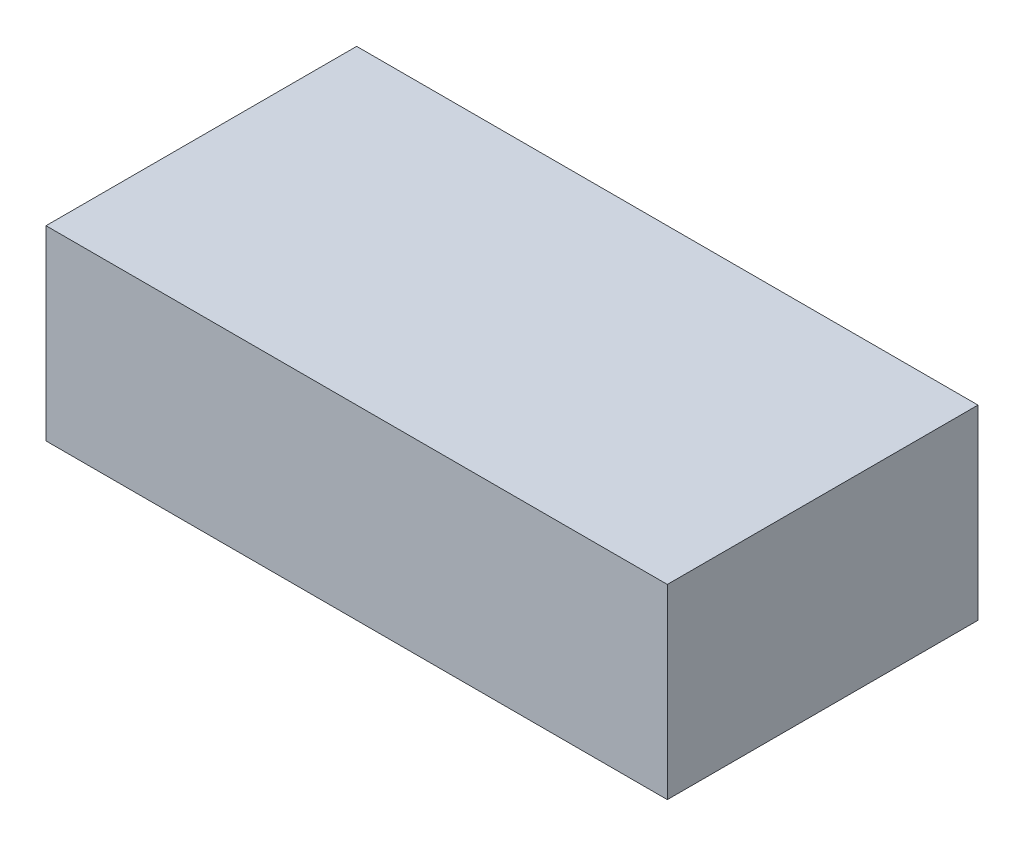
ISO-10303-21;
HEADER;
FILE_DESCRIPTION(('STEP AP214'),'2;1');
FILE_NAME('part.step','',(''),(''),'','','');
FILE_SCHEMA(('AUTOMOTIVE_DESIGN { 1 0 10303 214 1 1 1 1 }'));
ENDSEC;
DATA;
#1=APPLICATION_CONTEXT('core data for automotive mechanical design processes');
#2=APPLICATION_PROTOCOL_DEFINITION('international standard','automotive_design',2000,#1);
#3=PRODUCT_CONTEXT('',#1,'mechanical');
#4=PRODUCT('Part','Part','',(#3));
#5=PRODUCT_RELATED_PRODUCT_CATEGORY('part','',(#4));
#6=PRODUCT_DEFINITION_FORMATION('','',#4);
#7=PRODUCT_DEFINITION_CONTEXT('part definition',#1,'design');
#8=PRODUCT_DEFINITION('design','',#6,#7);
#9=PRODUCT_DEFINITION_SHAPE('','',#8);
#10=(LENGTH_UNIT() NAMED_UNIT(*) SI_UNIT(.MILLI.,.METRE.));
#11=(NAMED_UNIT(*) PLANE_ANGLE_UNIT() SI_UNIT($,.RADIAN.));
#12=(NAMED_UNIT(*) SI_UNIT($,.STERADIAN.) SOLID_ANGLE_UNIT());
#13=UNCERTAINTY_MEASURE_WITH_UNIT(LENGTH_MEASURE(1.E-05),#10,'distance_accuracy_value','');
#14=(GEOMETRIC_REPRESENTATION_CONTEXT(3) GLOBAL_UNCERTAINTY_ASSIGNED_CONTEXT((#13)) GLOBAL_UNIT_ASSIGNED_CONTEXT((#10,
#11,#12)) REPRESENTATION_CONTEXT('',''));
#15=CARTESIAN_POINT('',(0.,0.,0.));
#16=DIRECTION('',(0.,0.,1.));
#17=DIRECTION('',(1.,0.,0.));
#18=AXIS2_PLACEMENT_3D('',#15,#16,#17);
#19=CARTESIAN_POINT('',(10.,-3.,10.));
#20=DIRECTION('',(-1.,0.,0.));
#21=DIRECTION('',(0.,0.,1.));
#22=AXIS2_PLACEMENT_3D('',#19,#20,#21);
#23=PLANE('',#22);
#24=DIRECTION('',(0.,1.,0.));
#25=VECTOR('',#24,1.);
#26=CARTESIAN_POINT('',(10.,-3.,0.));
#27=LINE('',#26,#25);
#28=CARTESIAN_POINT('',(10.,-3.,0.));
#29=VERTEX_POINT('',#28);
#30=CARTESIAN_POINT('',(10.,3.,0.));
#31=VERTEX_POINT('',#30);
#32=EDGE_CURVE('E104',#29,#31,#27,.T.);
#33=ORIENTED_EDGE('',*,*,#32,.T.);
#34=DIRECTION('',(0.,0.,-1.));
#35=VECTOR('',#34,1.);
#36=CARTESIAN_POINT('',(10.,3.,10.));
#37=LINE('',#36,#35);
#38=CARTESIAN_POINT('',(10.,3.,10.));
#39=VERTEX_POINT('',#38);
#40=EDGE_CURVE('E11',#39,#31,#37,.T.);
#41=ORIENTED_EDGE('',*,*,#40,.F.);
#42=DIRECTION('',(0.,1.,0.));
#43=VECTOR('',#42,1.);
#44=CARTESIAN_POINT('',(10.,-3.,10.));
#45=LINE('',#44,#43);
#46=CARTESIAN_POINT('',(10.,-3.,10.));
#47=VERTEX_POINT('',#46);
#48=EDGE_CURVE('E92',#47,#39,#45,.T.);
#49=ORIENTED_EDGE('',*,*,#48,.F.);
#50=DIRECTION('',(0.,0.,-1.));
#51=VECTOR('',#50,1.);
#52=CARTESIAN_POINT('',(10.,-3.,10.));
#53=LINE('',#52,#51);
#54=EDGE_CURVE('E100',#47,#29,#53,.T.);
#55=ORIENTED_EDGE('',*,*,#54,.T.);
#56=EDGE_LOOP('',(#33,#41,#49,#55));
#57=FACE_BOUND('',#56,.T.);
#58=ADVANCED_FACE('F41',(#57),#23,.F.);
#59=CARTESIAN_POINT('',(-10.,3.,10.));
#60=DIRECTION('',(0.,-1.,0.));
#61=DIRECTION('',(0.,0.,-1.));
#62=AXIS2_PLACEMENT_3D('',#59,#60,#61);
#63=PLANE('',#62);
#64=DIRECTION('',(-1.,0.,0.));
#65=VECTOR('',#64,1.);
#66=CARTESIAN_POINT('',(-10.,3.,0.));
#67=LINE('',#66,#65);
#68=CARTESIAN_POINT('',(-10.,3.,0.));
#69=VERTEX_POINT('',#68);
#70=EDGE_CURVE('E96',#31,#69,#67,.T.);
#71=ORIENTED_EDGE('',*,*,#70,.T.);
#72=DIRECTION('',(0.,0.,-1.));
#73=VECTOR('',#72,1.);
#74=CARTESIAN_POINT('',(-10.,3.,10.));
#75=LINE('',#74,#73);
#76=CARTESIAN_POINT('',(-10.,3.,10.));
#77=VERTEX_POINT('',#76);
#78=EDGE_CURVE('E49',#77,#69,#75,.T.);
#79=ORIENTED_EDGE('',*,*,#78,.F.);
#80=DIRECTION('',(-1.,0.,0.));
#81=VECTOR('',#80,1.);
#82=CARTESIAN_POINT('',(-10.,3.,10.));
#83=LINE('',#82,#81);
#84=EDGE_CURVE('E87',#39,#77,#83,.T.);
#85=ORIENTED_EDGE('',*,*,#84,.F.);
#86=ORIENTED_EDGE('',*,*,#40,.T.);
#87=EDGE_LOOP('',(#71,#79,#85,#86));
#88=FACE_BOUND('',#87,.T.);
#89=ADVANCED_FACE('F95',(#88),#63,.F.);
#90=CARTESIAN_POINT('',(-10.,-3.,10.));
#91=DIRECTION('',(1.,0.,0.));
#92=DIRECTION('',(0.,0.,-1.));
#93=AXIS2_PLACEMENT_3D('',#90,#91,#92);
#94=PLANE('',#93);
#95=DIRECTION('',(0.,-1.,0.));
#96=VECTOR('',#95,1.);
#97=CARTESIAN_POINT('',(-10.,-3.,0.));
#98=LINE('',#97,#96);
#99=CARTESIAN_POINT('',(-10.,-3.,0.));
#100=VERTEX_POINT('',#99);
#101=EDGE_CURVE('E74',#69,#100,#98,.T.);
#102=ORIENTED_EDGE('',*,*,#101,.T.);
#103=DIRECTION('',(0.,0.,-1.));
#104=VECTOR('',#103,1.);
#105=CARTESIAN_POINT('',(-10.,-3.,10.));
#106=LINE('',#105,#104);
#107=CARTESIAN_POINT('',(-10.,-3.,10.));
#108=VERTEX_POINT('',#107);
#109=EDGE_CURVE('E97',#108,#100,#106,.T.);
#110=ORIENTED_EDGE('',*,*,#109,.F.);
#111=DIRECTION('',(0.,-1.,0.));
#112=VECTOR('',#111,1.);
#113=CARTESIAN_POINT('',(-10.,-3.,10.));
#114=LINE('',#113,#112);
#115=EDGE_CURVE('E90',#77,#108,#114,.T.);
#116=ORIENTED_EDGE('',*,*,#115,.F.);
#117=ORIENTED_EDGE('',*,*,#78,.T.);
#118=EDGE_LOOP('',(#102,#110,#116,#117));
#119=FACE_BOUND('',#118,.T.);
#120=ADVANCED_FACE('F98',(#119),#94,.F.);
#121=CARTESIAN_POINT('',(-10.,-3.,10.));
#122=DIRECTION('',(0.,1.,0.));
#123=DIRECTION('',(0.,0.,1.));
#124=AXIS2_PLACEMENT_3D('',#121,#122,#123);
#125=PLANE('',#124);
#126=DIRECTION('',(1.,0.,0.));
#127=VECTOR('',#126,1.);
#128=CARTESIAN_POINT('',(-10.,-3.,0.));
#129=LINE('',#128,#127);
#130=EDGE_CURVE('E80',#100,#29,#129,.T.);
#131=ORIENTED_EDGE('',*,*,#130,.T.);
#132=ORIENTED_EDGE('',*,*,#54,.F.);
#133=DIRECTION('',(1.,0.,0.));
#134=VECTOR('',#133,1.);
#135=CARTESIAN_POINT('',(-10.,-3.,10.));
#136=LINE('',#135,#134);
#137=EDGE_CURVE('E57',#108,#47,#136,.T.);
#138=ORIENTED_EDGE('',*,*,#137,.F.);
#139=ORIENTED_EDGE('',*,*,#109,.T.);
#140=EDGE_LOOP('',(#131,#132,#138,#139));
#141=FACE_BOUND('',#140,.T.);
#142=ADVANCED_FACE('F111',(#141),#125,.F.);
#143=CARTESIAN_POINT('',(0.,0.,10.));
#144=DIRECTION('',(0.,0.,-1.));
#145=DIRECTION('',(-1.,0.,0.));
#146=AXIS2_PLACEMENT_3D('',#143,#144,#145);
#147=PLANE('',#146);
#148=ORIENTED_EDGE('',*,*,#48,.T.);
#149=ORIENTED_EDGE('',*,*,#84,.T.);
#150=ORIENTED_EDGE('',*,*,#115,.T.);
#151=ORIENTED_EDGE('',*,*,#137,.T.);
#152=EDGE_LOOP('',(#148,#149,#150,#151));
#153=FACE_BOUND('',#152,.T.);
#154=ADVANCED_FACE('F88',(#153),#147,.F.);
#155=CARTESIAN_POINT('',(0.,0.,0.));
#156=DIRECTION('',(0.,0.,-1.));
#157=DIRECTION('',(-1.,0.,0.));
#158=AXIS2_PLACEMENT_3D('',#155,#156,#157);
#159=PLANE('',#158);
#160=ORIENTED_EDGE('',*,*,#32,.F.);
#161=ORIENTED_EDGE('',*,*,#130,.F.);
#162=ORIENTED_EDGE('',*,*,#101,.F.);
#163=ORIENTED_EDGE('',*,*,#70,.F.);
#164=EDGE_LOOP('',(#160,#161,#162,#163));
#165=FACE_BOUND('',#164,.T.);
#166=ADVANCED_FACE('F114',(#165),#159,.T.);
#167=CLOSED_SHELL('',(#58,#89,#120,#142,#154,#166));
#168=MANIFOLD_SOLID_BREP('B2',#167);
#169=ADVANCED_BREP_SHAPE_REPRESENTATION('',(#18,#168),#14);
#170=SHAPE_DEFINITION_REPRESENTATION(#9,#169);
ENDSEC;
END-ISO-10303-21;
